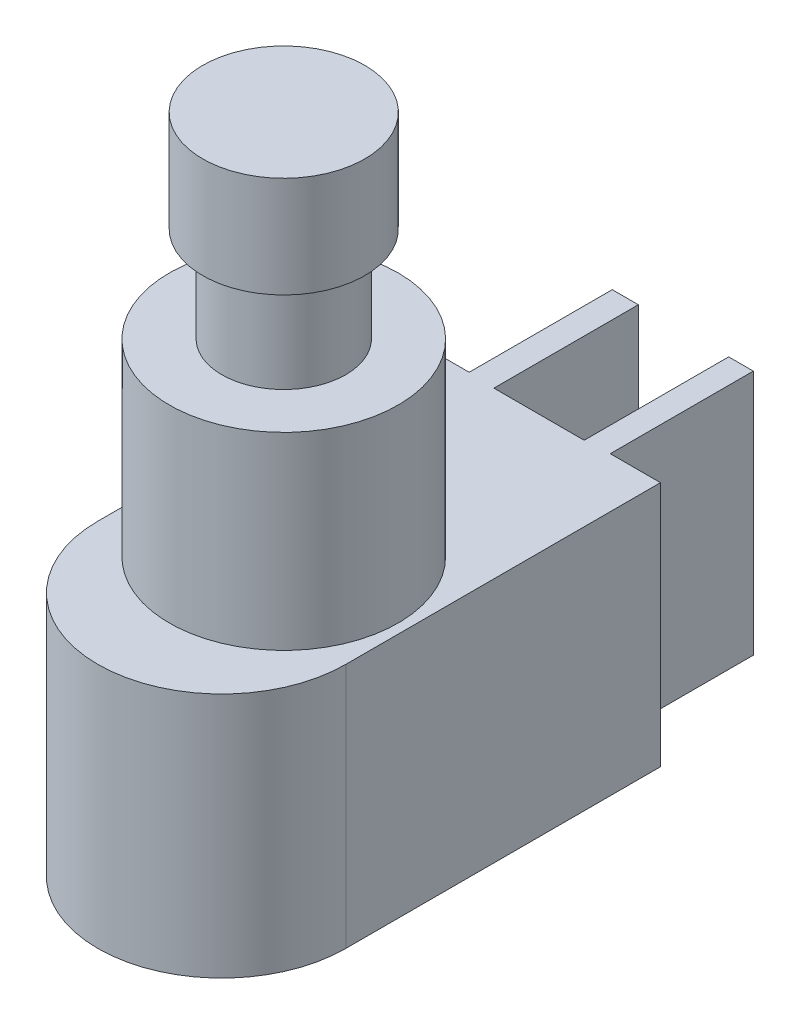
ISO-10303-21;
HEADER;
FILE_DESCRIPTION(('STEP AP214'),'2;1');
FILE_NAME('part.step','',(''),(''),'','','');
FILE_SCHEMA(('AUTOMOTIVE_DESIGN { 1 0 10303 214 1 1 1 1 }'));
ENDSEC;
DATA;
#1=APPLICATION_CONTEXT('core data for automotive mechanical design processes');
#2=APPLICATION_PROTOCOL_DEFINITION('international standard','automotive_design',2000,#1);
#3=PRODUCT_CONTEXT('',#1,'mechanical');
#4=PRODUCT('Part','Part','',(#3));
#5=PRODUCT_RELATED_PRODUCT_CATEGORY('part','',(#4));
#6=PRODUCT_DEFINITION_FORMATION('','',#4);
#7=PRODUCT_DEFINITION_CONTEXT('part definition',#1,'design');
#8=PRODUCT_DEFINITION('design','',#6,#7);
#9=PRODUCT_DEFINITION_SHAPE('','',#8);
#10=(LENGTH_UNIT() NAMED_UNIT(*) SI_UNIT(.MILLI.,.METRE.));
#11=(NAMED_UNIT(*) PLANE_ANGLE_UNIT() SI_UNIT($,.RADIAN.));
#12=(NAMED_UNIT(*) SI_UNIT($,.STERADIAN.) SOLID_ANGLE_UNIT());
#13=UNCERTAINTY_MEASURE_WITH_UNIT(LENGTH_MEASURE(1.E-05),#10,'distance_accuracy_value','');
#14=(GEOMETRIC_REPRESENTATION_CONTEXT(3) GLOBAL_UNCERTAINTY_ASSIGNED_CONTEXT((#13)) GLOBAL_UNIT_ASSIGNED_CONTEXT((#10,
#11,#12)) REPRESENTATION_CONTEXT('',''));
#15=CARTESIAN_POINT('',(0.,0.,0.));
#16=DIRECTION('',(0.,0.,1.));
#17=DIRECTION('',(1.,0.,0.));
#18=AXIS2_PLACEMENT_3D('',#15,#16,#17);
#19=CARTESIAN_POINT('',(0.,-12.9,-20.75));
#20=DIRECTION('',(0.,0.,-1.));
#21=DIRECTION('',(-1.,0.,0.));
#22=AXIS2_PLACEMENT_3D('',#19,#20,#21);
#23=PLANE('',#22);
#24=DIRECTION('',(0.,1.,0.));
#25=VECTOR('',#24,1.);
#26=CARTESIAN_POINT('',(2.57504403532138,-12.9,-20.75));
#27=LINE('',#26,#25);
#28=CARTESIAN_POINT('',(2.57504403532138,-12.9,-20.75));
#29=VERTEX_POINT('',#28);
#30=CARTESIAN_POINT('',(2.57504403532138,0.,-20.75));
#31=VERTEX_POINT('',#30);
#32=EDGE_CURVE('E239',#29,#31,#27,.T.);
#33=ORIENTED_EDGE('',*,*,#32,.T.);
#34=DIRECTION('',(-1.,0.,0.));
#35=VECTOR('',#34,1.);
#36=CARTESIAN_POINT('',(0.,0.,-20.75));
#37=LINE('',#36,#35);
#38=CARTESIAN_POINT('',(3.86817230202397,0.,-20.75));
#39=VERTEX_POINT('',#38);
#40=EDGE_CURVE('E128',#39,#31,#37,.T.);
#41=ORIENTED_EDGE('',*,*,#40,.F.);
#42=DIRECTION('',(0.,1.,0.));
#43=VECTOR('',#42,1.);
#44=CARTESIAN_POINT('',(3.86817230202397,-12.9,-20.75));
#45=LINE('',#44,#43);
#46=CARTESIAN_POINT('',(3.86817230202397,-12.9,-20.75));
#47=VERTEX_POINT('',#46);
#48=EDGE_CURVE('E122',#47,#39,#45,.T.);
#49=ORIENTED_EDGE('',*,*,#48,.F.);
#50=DIRECTION('',(-1.,0.,0.));
#51=VECTOR('',#50,1.);
#52=CARTESIAN_POINT('',(0.,-12.9,-20.75));
#53=LINE('',#52,#51);
#54=EDGE_CURVE('E126',#47,#29,#53,.T.);
#55=ORIENTED_EDGE('',*,*,#54,.T.);
#56=EDGE_LOOP('',(#33,#41,#49,#55));
#57=FACE_BOUND('',#56,.T.);
#58=ADVANCED_FACE('F41',(#57),#23,.T.);
#59=CARTESIAN_POINT('',(0.,9.9,0.));
#60=DIRECTION('',(0.,-1.,0.));
#61=DIRECTION('',(0.,0.,-1.));
#62=AXIS2_PLACEMENT_3D('',#59,#60,#61);
#63=CYLINDRICAL_SURFACE('',#62,6.);
#64=CARTESIAN_POINT('',(0.,9.9,0.));
#65=DIRECTION('',(0.,1.,0.));
#66=DIRECTION('',(0.,0.,1.));
#67=AXIS2_PLACEMENT_3D('',#64,#65,#66);
#68=CIRCLE('',#67,6.);
#69=CARTESIAN_POINT('',(0.,9.9,-6.));
#70=VERTEX_POINT('',#69);
#71=EDGE_CURVE('E12',#70,#70,#68,.T.);
#72=CARTESIAN_POINT('',(0.,0.,0.));
#73=DIRECTION('',(0.,1.,0.));
#74=DIRECTION('',(0.,0.,1.));
#75=AXIS2_PLACEMENT_3D('',#72,#73,#74);
#76=CIRCLE('',#75,6.);
#77=CARTESIAN_POINT('',(0.,0.,-6.));
#78=VERTEX_POINT('',#77);
#79=EDGE_CURVE('E45',#78,#78,#76,.T.);
#80=CARTESIAN_POINT('',(0.,9.9,-6.));
#81=CARTESIAN_POINT('',(0.,9.796875,-6.));
#82=CARTESIAN_POINT('',(0.,9.69375,-6.));
#83=CARTESIAN_POINT('',(0.,9.4875,-6.));
#84=CARTESIAN_POINT('',(0.,9.384375,-6.));
#85=CARTESIAN_POINT('',(0.,9.178125,-6.));
#86=CARTESIAN_POINT('',(0.,9.075,-6.));
#87=CARTESIAN_POINT('',(0.,8.86875,-6.));
#88=CARTESIAN_POINT('',(0.,8.765625,-6.));
#89=CARTESIAN_POINT('',(0.,8.559375,-6.));
#90=CARTESIAN_POINT('',(0.,8.45625,-6.));
#91=CARTESIAN_POINT('',(0.,8.25,-6.));
#92=CARTESIAN_POINT('',(0.,8.146875,-6.));
#93=CARTESIAN_POINT('',(0.,7.940625,-6.));
#94=CARTESIAN_POINT('',(0.,7.8375,-6.));
#95=CARTESIAN_POINT('',(0.,7.63125,-6.));
#96=CARTESIAN_POINT('',(0.,7.528125,-6.));
#97=CARTESIAN_POINT('',(0.,7.321875,-6.));
#98=CARTESIAN_POINT('',(0.,7.21875,-6.));
#99=CARTESIAN_POINT('',(0.,7.0125,-6.));
#100=CARTESIAN_POINT('',(0.,6.909375,-6.));
#101=CARTESIAN_POINT('',(0.,6.703125,-6.));
#102=CARTESIAN_POINT('',(0.,6.6,-6.));
#103=CARTESIAN_POINT('',(0.,6.39375,-6.));
#104=CARTESIAN_POINT('',(0.,6.290625,-6.));
#105=CARTESIAN_POINT('',(0.,6.084375,-6.));
#106=CARTESIAN_POINT('',(0.,5.98125,-6.));
#107=CARTESIAN_POINT('',(0.,5.775,-6.));
#108=CARTESIAN_POINT('',(0.,5.671875,-6.));
#109=CARTESIAN_POINT('',(0.,5.465625,-6.));
#110=CARTESIAN_POINT('',(0.,5.3625,-6.));
#111=CARTESIAN_POINT('',(0.,5.15625,-6.));
#112=CARTESIAN_POINT('',(0.,5.053125,-6.));
#113=CARTESIAN_POINT('',(0.,4.846875,-6.));
#114=CARTESIAN_POINT('',(0.,4.74375,-6.));
#115=CARTESIAN_POINT('',(0.,4.5375,-6.));
#116=CARTESIAN_POINT('',(0.,4.434375,-6.));
#117=CARTESIAN_POINT('',(0.,4.228125,-6.));
#118=CARTESIAN_POINT('',(0.,4.125,-6.));
#119=CARTESIAN_POINT('',(0.,3.91875,-6.));
#120=CARTESIAN_POINT('',(0.,3.815625,-6.));
#121=CARTESIAN_POINT('',(0.,3.609375,-6.));
#122=CARTESIAN_POINT('',(0.,3.50625,-6.));
#123=CARTESIAN_POINT('',(0.,3.3,-6.));
#124=CARTESIAN_POINT('',(0.,3.196875,-6.));
#125=CARTESIAN_POINT('',(0.,2.990625,-6.));
#126=CARTESIAN_POINT('',(0.,2.8875,-6.));
#127=CARTESIAN_POINT('',(0.,2.68125,-6.));
#128=CARTESIAN_POINT('',(0.,2.578125,-6.));
#129=CARTESIAN_POINT('',(0.,2.371875,-6.));
#130=CARTESIAN_POINT('',(0.,2.26875,-6.));
#131=CARTESIAN_POINT('',(0.,2.0625,-6.));
#132=CARTESIAN_POINT('',(0.,1.959375,-6.));
#133=CARTESIAN_POINT('',(0.,1.753125,-6.));
#134=CARTESIAN_POINT('',(0.,1.65,-6.));
#135=CARTESIAN_POINT('',(0.,1.44375,-6.));
#136=CARTESIAN_POINT('',(0.,1.340625,-6.));
#137=CARTESIAN_POINT('',(0.,1.134375,-6.));
#138=CARTESIAN_POINT('',(0.,1.03125,-6.));
#139=CARTESIAN_POINT('',(0.,0.825,-6.));
#140=CARTESIAN_POINT('',(0.,0.721875,-6.));
#141=CARTESIAN_POINT('',(0.,0.515625,-6.));
#142=CARTESIAN_POINT('',(0.,0.4125,-6.));
#143=CARTESIAN_POINT('',(0.,0.20625,-6.));
#144=CARTESIAN_POINT('',(0.,0.103125,-6.));
#145=CARTESIAN_POINT('',(0.,0.,-6.));
#146=B_SPLINE_CURVE_WITH_KNOTS('',3,(#80,#81,#82,#83,#84,#85,#86,#87,#88,#89,#90,#91,#92,#93,
#94,#95,#96,#97,#98,#99,#100,#101,#102,#103,#104,#105,#106,#107,#108,#109,#110,#111,#112,#113,
#114,#115,#116,#117,#118,#119,#120,#121,#122,#123,#124,#125,#126,#127,#128,#129,#130,#131,#132,
#133,#134,#135,#136,#137,#138,#139,#140,#141,#142,#143,#144,#145),.UNSPECIFIED.,.F.,.F.,(4,2,2,
2,2,2,2,2,2,2,2,2,2,2,2,2,2,2,2,2,2,2,2,2,2,2,2,2,2,2,2,2,4),(0.,0.309374999999999,
0.618749999999999,0.928124999999998,1.2375,1.546875,1.85625,2.165625,2.475,2.784375,3.09375,
3.403125,3.7125,4.021875,4.33125,4.640625,4.95,5.259375,5.56875,5.878125,6.1875,6.496875,
6.80625,7.115625,7.425,7.734375,8.04375,8.353125,8.6625,8.971875,9.28125,9.590625,9.9),.UNSPECIFIED.);
#147=EDGE_CURVE('BSEAM43',#70,#78,#146,.T.);
#148=ORIENTED_EDGE('',*,*,#71,.F.);
#149=ORIENTED_EDGE('',*,*,#79,.T.);
#150=ORIENTED_EDGE('',*,*,#147,.T.);
#151=ORIENTED_EDGE('',*,*,#147,.F.);
#152=EDGE_LOOP('',(#148,#150,#149,#151));
#153=FACE_BOUND('',#152,.T.);
#154=ADVANCED_FACE('F43',(#153),#63,.T.);
#155=CARTESIAN_POINT('',(0.,9.9,0.));
#156=DIRECTION('',(0.,1.,0.));
#157=DIRECTION('',(0.,0.,1.));
#158=AXIS2_PLACEMENT_3D('',#155,#156,#157);
#159=PLANE('',#158);
#160=ORIENTED_EDGE('',*,*,#71,.T.);
#161=EDGE_LOOP('',(#160));
#162=FACE_BOUND('',#161,.T.);
#163=CARTESIAN_POINT('',(0.,9.9,0.));
#164=DIRECTION('',(0.,1.,0.));
#165=DIRECTION('',(1.,0.,0.));
#166=AXIS2_PLACEMENT_3D('',#163,#164,#165);
#167=CIRCLE('',#166,3.25);
#168=CARTESIAN_POINT('',(3.25,9.9,0.));
#169=VERTEX_POINT('',#168);
#170=EDGE_CURVE('E189',#169,#169,#167,.T.);
#171=ORIENTED_EDGE('',*,*,#170,.F.);
#172=EDGE_LOOP('',(#171));
#173=FACE_BOUND('',#172,.T.);
#174=ADVANCED_FACE('F218',(#162,#173),#159,.T.);
#175=CARTESIAN_POINT('',(0.,14.9,0.));
#176=DIRECTION('',(0.,1.,0.));
#177=DIRECTION('',(0.,0.,1.));
#178=AXIS2_PLACEMENT_3D('',#175,#176,#177);
#179=PLANE('',#178);
#180=CARTESIAN_POINT('',(0.,14.9,0.));
#181=DIRECTION('',(0.,1.,0.));
#182=DIRECTION('',(0.,0.,1.));
#183=AXIS2_PLACEMENT_3D('',#180,#181,#182);
#184=CIRCLE('',#183,4.25);
#185=CARTESIAN_POINT('',(0.,14.9,-4.25));
#186=VERTEX_POINT('',#185);
#187=EDGE_CURVE('E188',#186,#186,#184,.T.);
#188=ORIENTED_EDGE('',*,*,#187,.F.);
#189=EDGE_LOOP('',(#188));
#190=FACE_BOUND('',#189,.T.);
#191=CARTESIAN_POINT('',(0.,14.9,0.));
#192=DIRECTION('',(0.,1.,0.));
#193=DIRECTION('',(1.,0.,0.));
#194=AXIS2_PLACEMENT_3D('',#191,#192,#193);
#195=CIRCLE('',#194,3.25);
#196=CARTESIAN_POINT('',(3.25,14.9,0.));
#197=VERTEX_POINT('',#196);
#198=EDGE_CURVE('E185',#197,#197,#195,.T.);
#199=ORIENTED_EDGE('',*,*,#198,.T.);
#200=EDGE_LOOP('',(#199));
#201=FACE_BOUND('',#200,.T.);
#202=ADVANCED_FACE('F332',(#190,#201),#179,.F.);
#203=CARTESIAN_POINT('',(0.,14.9,0.));
#204=DIRECTION('',(0.,-1.,0.));
#205=DIRECTION('',(0.,0.,-1.));
#206=AXIS2_PLACEMENT_3D('',#203,#204,#205);
#207=CYLINDRICAL_SURFACE('',#206,3.25);
#208=ORIENTED_EDGE('',*,*,#198,.F.);
#209=EDGE_LOOP('',(#208));
#210=FACE_BOUND('',#209,.T.);
#211=ORIENTED_EDGE('',*,*,#170,.T.);
#212=EDGE_LOOP('',(#211));
#213=FACE_BOUND('',#212,.T.);
#214=ADVANCED_FACE('F211',(#210,#213),#207,.T.);
#215=CARTESIAN_POINT('',(0.,20.2,0.));
#216=DIRECTION('',(0.,1.,0.));
#217=DIRECTION('',(0.,0.,1.));
#218=AXIS2_PLACEMENT_3D('',#215,#216,#217);
#219=PLANE('',#218);
#220=CARTESIAN_POINT('',(0.,20.2,0.));
#221=DIRECTION('',(0.,1.,0.));
#222=DIRECTION('',(0.,0.,1.));
#223=AXIS2_PLACEMENT_3D('',#220,#221,#222);
#224=CIRCLE('',#223,4.25);
#225=CARTESIAN_POINT('',(0.,20.2,-4.25));
#226=VERTEX_POINT('',#225);
#227=EDGE_CURVE('E50',#226,#226,#224,.T.);
#228=ORIENTED_EDGE('',*,*,#227,.T.);
#229=EDGE_LOOP('',(#228));
#230=FACE_BOUND('',#229,.T.);
#231=ADVANCED_FACE('F197',(#230),#219,.T.);
#232=CARTESIAN_POINT('',(0.,20.2,0.));
#233=DIRECTION('',(0.,-1.,0.));
#234=DIRECTION('',(0.,0.,-1.));
#235=AXIS2_PLACEMENT_3D('',#232,#233,#234);
#236=CYLINDRICAL_SURFACE('',#235,4.25);
#237=CARTESIAN_POINT('',(0.,14.9,-4.25));
#238=CARTESIAN_POINT('',(0.,14.9552083333333,-4.25));
#239=CARTESIAN_POINT('',(0.,15.0104166666667,-4.25));
#240=CARTESIAN_POINT('',(0.,15.1208333333333,-4.25));
#241=CARTESIAN_POINT('',(0.,15.1760416666667,-4.25));
#242=CARTESIAN_POINT('',(0.,15.2864583333333,-4.25));
#243=CARTESIAN_POINT('',(0.,15.3416666666667,-4.25));
#244=CARTESIAN_POINT('',(0.,15.4520833333333,-4.25));
#245=CARTESIAN_POINT('',(0.,15.5072916666667,-4.25));
#246=CARTESIAN_POINT('',(0.,15.6177083333333,-4.25));
#247=CARTESIAN_POINT('',(0.,15.6729166666667,-4.25));
#248=CARTESIAN_POINT('',(0.,15.7833333333333,-4.25));
#249=CARTESIAN_POINT('',(0.,15.8385416666667,-4.25));
#250=CARTESIAN_POINT('',(0.,15.9489583333333,-4.25));
#251=CARTESIAN_POINT('',(0.,16.0041666666667,-4.25));
#252=CARTESIAN_POINT('',(0.,16.1145833333333,-4.25));
#253=CARTESIAN_POINT('',(0.,16.1697916666667,-4.25));
#254=CARTESIAN_POINT('',(0.,16.2802083333333,-4.25));
#255=CARTESIAN_POINT('',(0.,16.3354166666667,-4.25));
#256=CARTESIAN_POINT('',(0.,16.4458333333333,-4.25));
#257=CARTESIAN_POINT('',(0.,16.5010416666667,-4.25));
#258=CARTESIAN_POINT('',(0.,16.6114583333333,-4.25));
#259=CARTESIAN_POINT('',(0.,16.6666666666667,-4.25));
#260=CARTESIAN_POINT('',(0.,16.7770833333333,-4.25));
#261=CARTESIAN_POINT('',(0.,16.8322916666667,-4.25));
#262=CARTESIAN_POINT('',(0.,16.9427083333333,-4.25));
#263=CARTESIAN_POINT('',(0.,16.9979166666667,-4.25));
#264=CARTESIAN_POINT('',(0.,17.1083333333333,-4.25));
#265=CARTESIAN_POINT('',(0.,17.1635416666667,-4.25));
#266=CARTESIAN_POINT('',(0.,17.2739583333333,-4.25));
#267=CARTESIAN_POINT('',(0.,17.3291666666667,-4.25));
#268=CARTESIAN_POINT('',(0.,17.4395833333333,-4.25));
#269=CARTESIAN_POINT('',(0.,17.4947916666667,-4.25));
#270=CARTESIAN_POINT('',(0.,17.6052083333333,-4.25));
#271=CARTESIAN_POINT('',(0.,17.6604166666667,-4.25));
#272=CARTESIAN_POINT('',(0.,17.7708333333333,-4.25));
#273=CARTESIAN_POINT('',(0.,17.8260416666667,-4.25));
#274=CARTESIAN_POINT('',(0.,17.9364583333333,-4.25));
#275=CARTESIAN_POINT('',(0.,17.9916666666667,-4.25));
#276=CARTESIAN_POINT('',(0.,18.1020833333333,-4.25));
#277=CARTESIAN_POINT('',(0.,18.1572916666667,-4.25));
#278=CARTESIAN_POINT('',(0.,18.2677083333333,-4.25));
#279=CARTESIAN_POINT('',(0.,18.3229166666667,-4.25));
#280=CARTESIAN_POINT('',(0.,18.4333333333333,-4.25));
#281=CARTESIAN_POINT('',(0.,18.4885416666667,-4.25));
#282=CARTESIAN_POINT('',(0.,18.5989583333333,-4.25));
#283=CARTESIAN_POINT('',(0.,18.6541666666667,-4.25));
#284=CARTESIAN_POINT('',(0.,18.7645833333333,-4.25));
#285=CARTESIAN_POINT('',(0.,18.8197916666667,-4.25));
#286=CARTESIAN_POINT('',(0.,18.9302083333333,-4.25));
#287=CARTESIAN_POINT('',(0.,18.9854166666667,-4.25));
#288=CARTESIAN_POINT('',(0.,19.0958333333333,-4.25));
#289=CARTESIAN_POINT('',(0.,19.1510416666667,-4.25));
#290=CARTESIAN_POINT('',(0.,19.2614583333333,-4.25));
#291=CARTESIAN_POINT('',(0.,19.3166666666667,-4.25));
#292=CARTESIAN_POINT('',(0.,19.4270833333333,-4.25));
#293=CARTESIAN_POINT('',(0.,19.4822916666667,-4.25));
#294=CARTESIAN_POINT('',(0.,19.5927083333333,-4.25));
#295=CARTESIAN_POINT('',(0.,19.6479166666667,-4.25));
#296=CARTESIAN_POINT('',(0.,19.7583333333333,-4.25));
#297=CARTESIAN_POINT('',(0.,19.8135416666667,-4.25));
#298=CARTESIAN_POINT('',(0.,19.9239583333333,-4.25));
#299=CARTESIAN_POINT('',(0.,19.9791666666667,-4.25));
#300=CARTESIAN_POINT('',(0.,20.0895833333333,-4.25));
#301=CARTESIAN_POINT('',(0.,20.1447916666667,-4.25));
#302=CARTESIAN_POINT('',(0.,20.2,-4.25));
#303=B_SPLINE_CURVE_WITH_KNOTS('',3,(#237,#238,#239,#240,#241,#242,#243,#244,#245,#246,#247,
#248,#249,#250,#251,#252,#253,#254,#255,#256,#257,#258,#259,#260,#261,#262,#263,#264,#265,#266,
#267,#268,#269,#270,#271,#272,#273,#274,#275,#276,#277,#278,#279,#280,#281,#282,#283,#284,#285,
#286,#287,#288,#289,#290,#291,#292,#293,#294,#295,#296,#297,#298,#299,#300,#301,#302),
.UNSPECIFIED.,.F.,.F.,(4,2,2,2,2,2,2,2,2,2,2,2,2,2,2,2,2,2,2,2,2,2,2,2,2,2,2,2,2,2,2,2,4),(0.,
0.165624999999999,0.331249999999998,0.496874999999999,0.6625,0.828124999999999,
0.993749999999998,1.159375,1.325,1.490625,1.65625,1.821875,1.9875,2.153125,2.31875,2.484375,
2.65,2.815625,2.98125,3.146875,3.3125,3.478125,3.64375,3.809375,3.975,4.140625,4.30625,4.471875,
4.6375,4.803125,4.96875,5.134375,5.3),.UNSPECIFIED.);
#304=EDGE_CURVE('BSEAM199',#186,#226,#303,.T.);
#305=ORIENTED_EDGE('',*,*,#187,.T.);
#306=ORIENTED_EDGE('',*,*,#227,.F.);
#307=ORIENTED_EDGE('',*,*,#304,.T.);
#308=ORIENTED_EDGE('',*,*,#304,.F.);
#309=EDGE_LOOP('',(#305,#307,#306,#308));
#310=FACE_BOUND('',#309,.T.);
#311=ADVANCED_FACE('F199',(#310),#236,.T.);
#312=CARTESIAN_POINT('',(6.5,-12.9,0.));
#313=DIRECTION('',(1.,0.,0.));
#314=DIRECTION('',(0.,0.,-1.));
#315=AXIS2_PLACEMENT_3D('',#312,#313,#314);
#316=PLANE('',#315);
#317=DIRECTION('',(0.,0.,-1.));
#318=VECTOR('',#317,1.);
#319=CARTESIAN_POINT('',(6.5,0.,0.));
#320=LINE('',#319,#318);
#321=CARTESIAN_POINT('',(6.5,0.,3.25));
#322=VERTEX_POINT('',#321);
#323=CARTESIAN_POINT('',(6.5,0.,-13.25));
#324=VERTEX_POINT('',#323);
#325=EDGE_CURVE('E154',#322,#324,#320,.T.);
#326=ORIENTED_EDGE('',*,*,#325,.F.);
#327=DIRECTION('',(0.,1.,0.));
#328=VECTOR('',#327,1.);
#329=CARTESIAN_POINT('',(6.5,-12.9,3.25));
#330=LINE('',#329,#328);
#331=CARTESIAN_POINT('',(6.5,-12.9,3.25));
#332=VERTEX_POINT('',#331);
#333=EDGE_CURVE('E102',#332,#322,#330,.T.);
#334=ORIENTED_EDGE('',*,*,#333,.F.);
#335=DIRECTION('',(0.,0.,-1.));
#336=VECTOR('',#335,1.);
#337=CARTESIAN_POINT('',(6.5,-12.9,0.));
#338=LINE('',#337,#336);
#339=CARTESIAN_POINT('',(6.5,-12.9,-13.25));
#340=VERTEX_POINT('',#339);
#341=EDGE_CURVE('E253',#332,#340,#338,.T.);
#342=ORIENTED_EDGE('',*,*,#341,.T.);
#343=DIRECTION('',(0.,1.,0.));
#344=VECTOR('',#343,1.);
#345=CARTESIAN_POINT('',(6.5,-12.9,-13.25));
#346=LINE('',#345,#344);
#347=EDGE_CURVE('E66',#340,#324,#346,.T.);
#348=ORIENTED_EDGE('',*,*,#347,.T.);
#349=EDGE_LOOP('',(#326,#334,#342,#348));
#350=FACE_BOUND('',#349,.T.);
#351=ADVANCED_FACE('F201',(#350),#316,.T.);
#352=CARTESIAN_POINT('',(0.,-12.9,3.25));
#353=DIRECTION('',(0.,1.,0.));
#354=DIRECTION('',(0.,0.,1.));
#355=AXIS2_PLACEMENT_3D('',#352,#353,#354);
#356=CYLINDRICAL_SURFACE('',#355,6.5);
#357=CARTESIAN_POINT('',(0.,0.,3.25));
#358=DIRECTION('',(0.,-1.,0.));
#359=DIRECTION('',(0.,0.,-1.));
#360=AXIS2_PLACEMENT_3D('',#357,#358,#359);
#361=CIRCLE('',#360,6.5);
#362=CARTESIAN_POINT('',(-6.5,0.,3.25));
#363=VERTEX_POINT('',#362);
#364=EDGE_CURVE('E156',#322,#363,#361,.T.);
#365=ORIENTED_EDGE('',*,*,#364,.T.);
#366=DIRECTION('',(0.,1.,0.));
#367=VECTOR('',#366,1.);
#368=CARTESIAN_POINT('',(-6.5,-12.9,3.25));
#369=LINE('',#368,#367);
#370=CARTESIAN_POINT('',(-6.5,-12.9,3.25));
#371=VERTEX_POINT('',#370);
#372=EDGE_CURVE('E181',#371,#363,#369,.T.);
#373=ORIENTED_EDGE('',*,*,#372,.F.);
#374=CARTESIAN_POINT('',(0.,-12.9,3.25));
#375=DIRECTION('',(0.,-1.,0.));
#376=DIRECTION('',(0.,0.,-1.));
#377=AXIS2_PLACEMENT_3D('',#374,#375,#376);
#378=CIRCLE('',#377,6.5);
#379=EDGE_CURVE('E251',#332,#371,#378,.T.);
#380=ORIENTED_EDGE('',*,*,#379,.F.);
#381=ORIENTED_EDGE('',*,*,#333,.T.);
#382=EDGE_LOOP('',(#365,#373,#380,#381));
#383=FACE_BOUND('',#382,.T.);
#384=ADVANCED_FACE('F209',(#383),#356,.T.);
#385=CARTESIAN_POINT('',(-6.5,-12.9,0.));
#386=DIRECTION('',(1.,0.,0.));
#387=DIRECTION('',(0.,0.,-1.));
#388=AXIS2_PLACEMENT_3D('',#385,#386,#387);
#389=PLANE('',#388);
#390=DIRECTION('',(0.,0.,-1.));
#391=VECTOR('',#390,1.);
#392=CARTESIAN_POINT('',(-6.5,0.,0.));
#393=LINE('',#392,#391);
#394=CARTESIAN_POINT('',(-6.5,0.,-13.25));
#395=VERTEX_POINT('',#394);
#396=EDGE_CURVE('E159',#363,#395,#393,.T.);
#397=ORIENTED_EDGE('',*,*,#396,.T.);
#398=DIRECTION('',(0.,1.,0.));
#399=VECTOR('',#398,1.);
#400=CARTESIAN_POINT('',(-6.5,-12.9,-13.25));
#401=LINE('',#400,#399);
#402=CARTESIAN_POINT('',(-6.5,-12.9,-13.25));
#403=VERTEX_POINT('',#402);
#404=EDGE_CURVE('E179',#403,#395,#401,.T.);
#405=ORIENTED_EDGE('',*,*,#404,.F.);
#406=DIRECTION('',(0.,0.,-1.));
#407=VECTOR('',#406,1.);
#408=CARTESIAN_POINT('',(-6.5,-12.9,0.));
#409=LINE('',#408,#407);
#410=EDGE_CURVE('E248',#371,#403,#409,.T.);
#411=ORIENTED_EDGE('',*,*,#410,.F.);
#412=ORIENTED_EDGE('',*,*,#372,.T.);
#413=EDGE_LOOP('',(#397,#405,#411,#412));
#414=FACE_BOUND('',#413,.T.);
#415=ADVANCED_FACE('F298',(#414),#389,.F.);
#416=CARTESIAN_POINT('',(0.,-12.9,-13.25));
#417=DIRECTION('',(0.,0.,-1.));
#418=DIRECTION('',(-1.,0.,0.));
#419=AXIS2_PLACEMENT_3D('',#416,#417,#418);
#420=PLANE('',#419);
#421=DIRECTION('',(-1.,0.,0.));
#422=VECTOR('',#421,1.);
#423=CARTESIAN_POINT('',(0.,0.,-13.25));
#424=LINE('',#423,#422);
#425=CARTESIAN_POINT('',(-3.52798491244499,0.,-13.25));
#426=VERTEX_POINT('',#425);
#427=EDGE_CURVE('E162',#426,#395,#424,.T.);
#428=ORIENTED_EDGE('',*,*,#427,.F.);
#429=DIRECTION('',(0.,1.,0.));
#430=VECTOR('',#429,1.);
#431=CARTESIAN_POINT('',(-3.52798491244499,-12.9,-13.25));
#432=LINE('',#431,#430);
#433=CARTESIAN_POINT('',(-3.52798491244499,-12.9,-13.25));
#434=VERTEX_POINT('',#433);
#435=EDGE_CURVE('E177',#434,#426,#432,.T.);
#436=ORIENTED_EDGE('',*,*,#435,.F.);
#437=DIRECTION('',(-1.,0.,0.));
#438=VECTOR('',#437,1.);
#439=CARTESIAN_POINT('',(0.,-12.9,-13.25));
#440=LINE('',#439,#438);
#441=EDGE_CURVE('E151',#434,#403,#440,.T.);
#442=ORIENTED_EDGE('',*,*,#441,.T.);
#443=ORIENTED_EDGE('',*,*,#404,.T.);
#444=EDGE_LOOP('',(#428,#436,#442,#443));
#445=FACE_BOUND('',#444,.T.);
#446=ADVANCED_FACE('F230',(#445),#420,.T.);
#447=CARTESIAN_POINT('',(-3.527984912445,-12.9,0.));
#448=DIRECTION('',(1.,0.,0.));
#449=DIRECTION('',(0.,0.,-1.));
#450=AXIS2_PLACEMENT_3D('',#447,#448,#449);
#451=PLANE('',#450);
#452=DIRECTION('',(0.,0.,-1.));
#453=VECTOR('',#452,1.);
#454=CARTESIAN_POINT('',(-3.527984912445,0.,0.));
#455=LINE('',#454,#453);
#456=CARTESIAN_POINT('',(-3.52798491244499,0.,-20.75));
#457=VERTEX_POINT('',#456);
#458=EDGE_CURVE('E165',#426,#457,#455,.T.);
#459=ORIENTED_EDGE('',*,*,#458,.T.);
#460=DIRECTION('',(0.,1.,0.));
#461=VECTOR('',#460,1.);
#462=CARTESIAN_POINT('',(-3.52798491244499,-12.9,-20.75));
#463=LINE('',#462,#461);
#464=CARTESIAN_POINT('',(-3.52798491244499,-12.9,-20.75));
#465=VERTEX_POINT('',#464);
#466=EDGE_CURVE('E133',#465,#457,#463,.T.);
#467=ORIENTED_EDGE('',*,*,#466,.F.);
#468=DIRECTION('',(0.,0.,-1.));
#469=VECTOR('',#468,1.);
#470=CARTESIAN_POINT('',(-3.527984912445,-12.9,0.));
#471=LINE('',#470,#469);
#472=EDGE_CURVE('E245',#434,#465,#471,.T.);
#473=ORIENTED_EDGE('',*,*,#472,.F.);
#474=ORIENTED_EDGE('',*,*,#435,.T.);
#475=EDGE_LOOP('',(#459,#467,#473,#474));
#476=FACE_BOUND('',#475,.T.);
#477=ADVANCED_FACE('F223',(#476),#451,.F.);
#478=DIRECTION('',(0.,1.,0.));
#479=VECTOR('',#478,1.);
#480=CARTESIAN_POINT('',(-2.15886511115926,-12.9,-20.75));
#481=LINE('',#480,#479);
#482=CARTESIAN_POINT('',(-2.15886511115926,-12.9,-20.75));
#483=VERTEX_POINT('',#482);
#484=CARTESIAN_POINT('',(-2.15886511115926,0.,-20.75));
#485=VERTEX_POINT('',#484);
#486=EDGE_CURVE('E57',#483,#485,#481,.T.);
#487=ORIENTED_EDGE('',*,*,#486,.F.);
#488=EDGE_CURVE('E145',#483,#465,#53,.T.);
#489=ORIENTED_EDGE('',*,*,#488,.T.);
#490=ORIENTED_EDGE('',*,*,#466,.T.);
#491=EDGE_CURVE('E169',#485,#457,#37,.T.);
#492=ORIENTED_EDGE('',*,*,#491,.F.);
#493=EDGE_LOOP('',(#487,#489,#490,#492));
#494=FACE_BOUND('',#493,.T.);
#495=ADVANCED_FACE('F214',(#494),#23,.T.);
#496=CARTESIAN_POINT('',(3.86817230202396,-12.9,0.));
#497=DIRECTION('',(1.,0.,0.));
#498=DIRECTION('',(0.,0.,-1.));
#499=AXIS2_PLACEMENT_3D('',#496,#497,#498);
#500=PLANE('',#499);
#501=DIRECTION('',(0.,0.,-1.));
#502=VECTOR('',#501,1.);
#503=CARTESIAN_POINT('',(3.86817230202396,0.,0.));
#504=LINE('',#503,#502);
#505=CARTESIAN_POINT('',(3.86817230202396,0.,-13.25));
#506=VERTEX_POINT('',#505);
#507=EDGE_CURVE('E171',#506,#39,#504,.T.);
#508=ORIENTED_EDGE('',*,*,#507,.F.);
#509=DIRECTION('',(0.,1.,0.));
#510=VECTOR('',#509,1.);
#511=CARTESIAN_POINT('',(3.86817230202396,-12.9,-13.25));
#512=LINE('',#511,#510);
#513=CARTESIAN_POINT('',(3.86817230202396,-12.9,-13.25));
#514=VERTEX_POINT('',#513);
#515=EDGE_CURVE('E134',#514,#506,#512,.T.);
#516=ORIENTED_EDGE('',*,*,#515,.F.);
#517=DIRECTION('',(0.,0.,-1.));
#518=VECTOR('',#517,1.);
#519=CARTESIAN_POINT('',(3.86817230202396,-12.9,0.));
#520=LINE('',#519,#518);
#521=EDGE_CURVE('E141',#514,#47,#520,.T.);
#522=ORIENTED_EDGE('',*,*,#521,.T.);
#523=ORIENTED_EDGE('',*,*,#48,.T.);
#524=EDGE_LOOP('',(#508,#516,#522,#523));
#525=FACE_BOUND('',#524,.T.);
#526=ADVANCED_FACE('F147',(#525),#500,.T.);
#527=EDGE_CURVE('E166',#324,#506,#424,.T.);
#528=ORIENTED_EDGE('',*,*,#527,.F.);
#529=ORIENTED_EDGE('',*,*,#347,.F.);
#530=EDGE_CURVE('E148',#340,#514,#440,.T.);
#531=ORIENTED_EDGE('',*,*,#530,.T.);
#532=ORIENTED_EDGE('',*,*,#515,.T.);
#533=EDGE_LOOP('',(#528,#529,#531,#532));
#534=FACE_BOUND('',#533,.T.);
#535=ADVANCED_FACE('F229',(#534),#420,.T.);
#536=CARTESIAN_POINT('',(0.,-12.9,0.));
#537=DIRECTION('',(0.,-1.,0.));
#538=DIRECTION('',(0.,0.,-1.));
#539=AXIS2_PLACEMENT_3D('',#536,#537,#538);
#540=PLANE('',#539);
#541=DIRECTION('',(0.,0.,-1.));
#542=VECTOR('',#541,1.);
#543=CARTESIAN_POINT('',(2.57504403532138,-12.9,-13.1750320967967));
#544=LINE('',#543,#542);
#545=CARTESIAN_POINT('',(2.57504403532138,-12.9,-13.1750320967967));
#546=VERTEX_POINT('',#545);
#547=EDGE_CURVE('E144',#546,#29,#544,.T.);
#548=ORIENTED_EDGE('',*,*,#547,.T.);
#549=ORIENTED_EDGE('',*,*,#54,.F.);
#550=ORIENTED_EDGE('',*,*,#521,.F.);
#551=ORIENTED_EDGE('',*,*,#530,.F.);
#552=ORIENTED_EDGE('',*,*,#341,.F.);
#553=ORIENTED_EDGE('',*,*,#379,.T.);
#554=ORIENTED_EDGE('',*,*,#410,.T.);
#555=ORIENTED_EDGE('',*,*,#441,.F.);
#556=ORIENTED_EDGE('',*,*,#472,.T.);
#557=ORIENTED_EDGE('',*,*,#488,.F.);
#558=DIRECTION('',(0.,0.,1.));
#559=VECTOR('',#558,1.);
#560=CARTESIAN_POINT('',(-2.15886511115926,-12.9,-13.1750320967967));
#561=LINE('',#560,#559);
#562=CARTESIAN_POINT('',(-2.15886511115926,-12.9,-13.1750320967967));
#563=VERTEX_POINT('',#562);
#564=EDGE_CURVE('E242',#483,#563,#561,.T.);
#565=ORIENTED_EDGE('',*,*,#564,.T.);
#566=DIRECTION('',(1.,0.,0.));
#567=VECTOR('',#566,1.);
#568=CARTESIAN_POINT('',(2.57504403532138,-12.9,-13.1750320967967));
#569=LINE('',#568,#567);
#570=EDGE_CURVE('E255',#563,#546,#569,.T.);
#571=ORIENTED_EDGE('',*,*,#570,.T.);
#572=EDGE_LOOP('',(#548,#549,#550,#551,#552,#553,#554,#555,#556,#557,#565,#571));
#573=FACE_BOUND('',#572,.T.);
#574=ADVANCED_FACE('F139',(#573),#540,.T.);
#575=CARTESIAN_POINT('',(0.,0.,0.));
#576=DIRECTION('',(0.,-1.,0.));
#577=DIRECTION('',(0.,0.,-1.));
#578=AXIS2_PLACEMENT_3D('',#575,#576,#577);
#579=PLANE('',#578);
#580=ORIENTED_EDGE('',*,*,#79,.F.);
#581=EDGE_LOOP('',(#580));
#582=FACE_BOUND('',#581,.T.);
#583=ORIENTED_EDGE('',*,*,#40,.T.);
#584=DIRECTION('',(0.,0.,-1.));
#585=VECTOR('',#584,1.);
#586=CARTESIAN_POINT('',(2.57504403532138,0.,-13.1750320967967));
#587=LINE('',#586,#585);
#588=CARTESIAN_POINT('',(2.57504403532138,0.,-13.1750320967967));
#589=VERTEX_POINT('',#588);
#590=EDGE_CURVE('E266',#589,#31,#587,.T.);
#591=ORIENTED_EDGE('',*,*,#590,.F.);
#592=DIRECTION('',(1.,0.,0.));
#593=VECTOR('',#592,1.);
#594=CARTESIAN_POINT('',(2.57504403532138,0.,-13.1750320967967));
#595=LINE('',#594,#593);
#596=CARTESIAN_POINT('',(-2.15886511115926,0.,-13.1750320967967));
#597=VERTEX_POINT('',#596);
#598=EDGE_CURVE('E261',#597,#589,#595,.T.);
#599=ORIENTED_EDGE('',*,*,#598,.F.);
#600=DIRECTION('',(0.,0.,1.));
#601=VECTOR('',#600,1.);
#602=CARTESIAN_POINT('',(-2.15886511115926,0.,-13.1750320967967));
#603=LINE('',#602,#601);
#604=EDGE_CURVE('E264',#485,#597,#603,.T.);
#605=ORIENTED_EDGE('',*,*,#604,.F.);
#606=ORIENTED_EDGE('',*,*,#491,.T.);
#607=ORIENTED_EDGE('',*,*,#458,.F.);
#608=ORIENTED_EDGE('',*,*,#427,.T.);
#609=ORIENTED_EDGE('',*,*,#396,.F.);
#610=ORIENTED_EDGE('',*,*,#364,.F.);
#611=ORIENTED_EDGE('',*,*,#325,.T.);
#612=ORIENTED_EDGE('',*,*,#527,.T.);
#613=ORIENTED_EDGE('',*,*,#507,.T.);
#614=EDGE_LOOP('',(#583,#591,#599,#605,#606,#607,#608,#609,#610,#611,#612,#613));
#615=FACE_BOUND('',#614,.T.);
#616=ADVANCED_FACE('F287',(#582,#615),#579,.F.);
#617=CARTESIAN_POINT('',(2.57504403532138,-12.9,-13.1750320967967));
#618=DIRECTION('',(1.,0.,0.));
#619=DIRECTION('',(0.,0.,-1.));
#620=AXIS2_PLACEMENT_3D('',#617,#618,#619);
#621=PLANE('',#620);
#622=ORIENTED_EDGE('',*,*,#590,.T.);
#623=ORIENTED_EDGE('',*,*,#32,.F.);
#624=ORIENTED_EDGE('',*,*,#547,.F.);
#625=DIRECTION('',(0.,1.,0.));
#626=VECTOR('',#625,1.);
#627=CARTESIAN_POINT('',(2.57504403532138,-12.9,-13.1750320967967));
#628=LINE('',#627,#626);
#629=EDGE_CURVE('E157',#546,#589,#628,.T.);
#630=ORIENTED_EDGE('',*,*,#629,.T.);
#631=EDGE_LOOP('',(#622,#623,#624,#630));
#632=FACE_BOUND('',#631,.T.);
#633=ADVANCED_FACE('F284',(#632),#621,.F.);
#634=CARTESIAN_POINT('',(2.57504403532138,-12.9,-13.1750320967967));
#635=DIRECTION('',(0.,0.,1.));
#636=DIRECTION('',(1.,0.,0.));
#637=AXIS2_PLACEMENT_3D('',#634,#635,#636);
#638=PLANE('',#637);
#639=ORIENTED_EDGE('',*,*,#598,.T.);
#640=ORIENTED_EDGE('',*,*,#629,.F.);
#641=ORIENTED_EDGE('',*,*,#570,.F.);
#642=DIRECTION('',(0.,1.,0.));
#643=VECTOR('',#642,1.);
#644=CARTESIAN_POINT('',(-2.15886511115926,-12.9,-13.1750320967967));
#645=LINE('',#644,#643);
#646=EDGE_CURVE('E238',#563,#597,#645,.T.);
#647=ORIENTED_EDGE('',*,*,#646,.T.);
#648=EDGE_LOOP('',(#639,#640,#641,#647));
#649=FACE_BOUND('',#648,.T.);
#650=ADVANCED_FACE('F275',(#649),#638,.F.);
#651=CARTESIAN_POINT('',(-2.15886511115926,-12.9,-13.1750320967967));
#652=DIRECTION('',(-1.,0.,0.));
#653=DIRECTION('',(0.,0.,1.));
#654=AXIS2_PLACEMENT_3D('',#651,#652,#653);
#655=PLANE('',#654);
#656=ORIENTED_EDGE('',*,*,#604,.T.);
#657=ORIENTED_EDGE('',*,*,#646,.F.);
#658=ORIENTED_EDGE('',*,*,#564,.F.);
#659=ORIENTED_EDGE('',*,*,#486,.T.);
#660=EDGE_LOOP('',(#656,#657,#658,#659));
#661=FACE_BOUND('',#660,.T.);
#662=ADVANCED_FACE('F302',(#661),#655,.F.);
#663=CLOSED_SHELL('',(#58,#154,#174,#202,#214,#231,#311,#351,#384,#415,#446,#477,#495,#526,#535,
#574,#616,#633,#650,#662));
#664=MANIFOLD_SOLID_BREP('B2',#663);
#665=ADVANCED_BREP_SHAPE_REPRESENTATION('',(#18,#664),#14);
#666=SHAPE_DEFINITION_REPRESENTATION(#9,#665);
ENDSEC;
END-ISO-10303-21;
